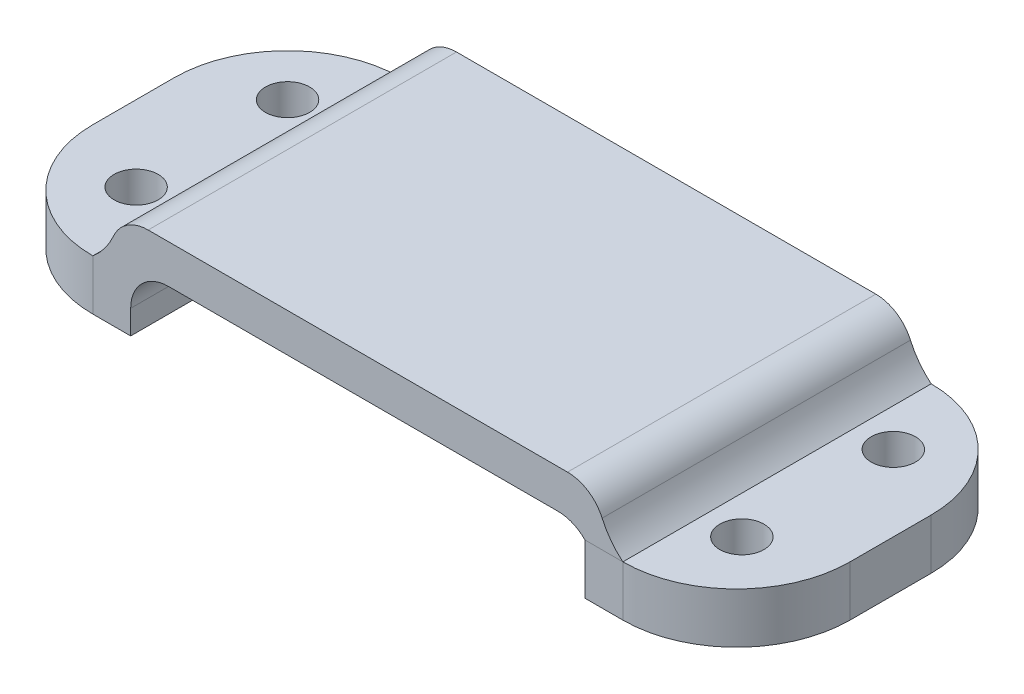
ISO-10303-21;
HEADER;
FILE_DESCRIPTION(('STEP AP214'),'2;1');
FILE_NAME('part.step','',(''),(''),'','','');
FILE_SCHEMA(('AUTOMOTIVE_DESIGN { 1 0 10303 214 1 1 1 1 }'));
ENDSEC;
DATA;
#1=APPLICATION_CONTEXT('core data for automotive mechanical design processes');
#2=APPLICATION_PROTOCOL_DEFINITION('international standard','automotive_design',2000,#1);
#3=PRODUCT_CONTEXT('',#1,'mechanical');
#4=PRODUCT('Part','Part','',(#3));
#5=PRODUCT_RELATED_PRODUCT_CATEGORY('part','',(#4));
#6=PRODUCT_DEFINITION_FORMATION('','',#4);
#7=PRODUCT_DEFINITION_CONTEXT('part definition',#1,'design');
#8=PRODUCT_DEFINITION('design','',#6,#7);
#9=PRODUCT_DEFINITION_SHAPE('','',#8);
#10=(LENGTH_UNIT() NAMED_UNIT(*) SI_UNIT(.MILLI.,.METRE.));
#11=(NAMED_UNIT(*) PLANE_ANGLE_UNIT() SI_UNIT($,.RADIAN.));
#12=(NAMED_UNIT(*) SI_UNIT($,.STERADIAN.) SOLID_ANGLE_UNIT());
#13=UNCERTAINTY_MEASURE_WITH_UNIT(LENGTH_MEASURE(1.E-05),#10,'distance_accuracy_value','');
#14=(GEOMETRIC_REPRESENTATION_CONTEXT(3) GLOBAL_UNCERTAINTY_ASSIGNED_CONTEXT((#13)) GLOBAL_UNIT_ASSIGNED_CONTEXT((#10,
#11,#12)) REPRESENTATION_CONTEXT('',''));
#15=CARTESIAN_POINT('',(0.,0.,0.));
#16=DIRECTION('',(0.,0.,1.));
#17=DIRECTION('',(1.,0.,0.));
#18=AXIS2_PLACEMENT_3D('',#15,#16,#17);
#19=CARTESIAN_POINT('',(0.,4.,-12.215));
#20=DIRECTION('',(0.,0.,1.));
#21=DIRECTION('',(1.,0.,0.));
#22=AXIS2_PLACEMENT_3D('',#19,#20,#21);
#23=PLANE('',#22);
#24=DIRECTION('',(-1.,0.,0.));
#25=VECTOR('',#24,1.);
#26=CARTESIAN_POINT('',(0.,4.,-12.215));
#27=LINE('',#26,#25);
#28=CARTESIAN_POINT('',(21.,4.,-12.215));
#29=VERTEX_POINT('',#28);
#30=CARTESIAN_POINT('',(18.,4.,-12.215));
#31=VERTEX_POINT('',#30);
#32=EDGE_CURVE('E105',#29,#31,#27,.T.);
#33=ORIENTED_EDGE('',*,*,#32,.F.);
#34=DIRECTION('',(0.,-1.,0.));
#35=VECTOR('',#34,1.);
#36=CARTESIAN_POINT('',(21.,4.,-12.215));
#37=LINE('',#36,#35);
#38=CARTESIAN_POINT('',(21.,0.,-12.215));
#39=VERTEX_POINT('',#38);
#40=EDGE_CURVE('E129',#29,#39,#37,.T.);
#41=ORIENTED_EDGE('',*,*,#40,.T.);
#42=DIRECTION('',(-1.,0.,0.));
#43=VECTOR('',#42,1.);
#44=CARTESIAN_POINT('',(0.,0.,-12.215));
#45=LINE('',#44,#43);
#46=CARTESIAN_POINT('',(18.,0.,-12.215));
#47=VERTEX_POINT('',#46);
#48=EDGE_CURVE('E127',#39,#47,#45,.T.);
#49=ORIENTED_EDGE('',*,*,#48,.T.);
#50=DIRECTION('',(0.,-1.,0.));
#51=VECTOR('',#50,1.);
#52=CARTESIAN_POINT('',(18.,4.,-12.215));
#53=LINE('',#52,#51);
#54=EDGE_CURVE('E121',#31,#47,#53,.T.);
#55=ORIENTED_EDGE('',*,*,#54,.F.);
#56=EDGE_LOOP('',(#33,#41,#49,#55));
#57=FACE_BOUND('',#56,.T.);
#58=ADVANCED_FACE('F51',(#57),#23,.F.);
#59=CARTESIAN_POINT('',(18.,4.,0.));
#60=DIRECTION('',(1.,0.,0.));
#61=DIRECTION('',(0.,0.,-1.));
#62=AXIS2_PLACEMENT_3D('',#59,#60,#61);
#63=PLANE('',#62);
#64=DIRECTION('',(0.,0.,1.));
#65=VECTOR('',#64,1.);
#66=CARTESIAN_POINT('',(18.,0.,0.));
#67=LINE('',#66,#65);
#68=CARTESIAN_POINT('',(18.,0.,12.215));
#69=VERTEX_POINT('',#68);
#70=EDGE_CURVE('E155',#47,#69,#67,.T.);
#71=ORIENTED_EDGE('',*,*,#70,.T.);
#72=DIRECTION('',(0.,-1.,0.));
#73=VECTOR('',#72,1.);
#74=CARTESIAN_POINT('',(18.,4.,12.215));
#75=LINE('',#74,#73);
#76=CARTESIAN_POINT('',(18.,4.,12.215));
#77=VERTEX_POINT('',#76);
#78=EDGE_CURVE('E123',#77,#69,#75,.T.);
#79=ORIENTED_EDGE('',*,*,#78,.F.);
#80=DIRECTION('',(0.,0.,1.));
#81=VECTOR('',#80,1.);
#82=CARTESIAN_POINT('',(18.,4.,0.));
#83=LINE('',#82,#81);
#84=EDGE_CURVE('E108',#31,#77,#83,.T.);
#85=ORIENTED_EDGE('',*,*,#84,.F.);
#86=ORIENTED_EDGE('',*,*,#54,.T.);
#87=EDGE_LOOP('',(#71,#79,#85,#86));
#88=FACE_BOUND('',#87,.T.);
#89=ADVANCED_FACE('F120',(#88),#63,.F.);
#90=CARTESIAN_POINT('',(0.,4.,12.215));
#91=DIRECTION('',(0.,0.,1.));
#92=DIRECTION('',(1.,0.,0.));
#93=AXIS2_PLACEMENT_3D('',#90,#91,#92);
#94=PLANE('',#93);
#95=DIRECTION('',(-1.,0.,0.));
#96=VECTOR('',#95,1.);
#97=CARTESIAN_POINT('',(0.,0.,12.215));
#98=LINE('',#97,#96);
#99=CARTESIAN_POINT('',(21.,0.,12.215));
#100=VERTEX_POINT('',#99);
#101=EDGE_CURVE('E153',#100,#69,#98,.T.);
#102=ORIENTED_EDGE('',*,*,#101,.F.);
#103=DIRECTION('',(0.,-1.,0.));
#104=VECTOR('',#103,1.);
#105=CARTESIAN_POINT('',(21.,4.,12.215));
#106=LINE('',#105,#104);
#107=CARTESIAN_POINT('',(21.,4.,12.215));
#108=VERTEX_POINT('',#107);
#109=EDGE_CURVE('E12',#100,#108,#106,.F.);
#110=ORIENTED_EDGE('',*,*,#109,.T.);
#111=DIRECTION('',(-1.,0.,0.));
#112=VECTOR('',#111,1.);
#113=CARTESIAN_POINT('',(0.,4.,12.215));
#114=LINE('',#113,#112);
#115=EDGE_CURVE('E124',#108,#77,#114,.T.);
#116=ORIENTED_EDGE('',*,*,#115,.T.);
#117=ORIENTED_EDGE('',*,*,#78,.T.);
#118=EDGE_LOOP('',(#102,#110,#116,#117));
#119=FACE_BOUND('',#118,.T.);
#120=ADVANCED_FACE('F154',(#119),#94,.T.);
#121=CARTESIAN_POINT('',(30.,4.,0.));
#122=DIRECTION('',(-1.,0.,0.));
#123=DIRECTION('',(0.,0.,1.));
#124=AXIS2_PLACEMENT_3D('',#121,#122,#123);
#125=PLANE('',#124);
#126=DIRECTION('',(0.,0.,-1.));
#127=VECTOR('',#126,1.);
#128=CARTESIAN_POINT('',(30.,0.,0.));
#129=LINE('',#128,#127);
#130=CARTESIAN_POINT('',(30.,0.,3.215));
#131=VERTEX_POINT('',#130);
#132=CARTESIAN_POINT('',(30.,0.,-3.215));
#133=VERTEX_POINT('',#132);
#134=EDGE_CURVE('E115',#131,#133,#129,.T.);
#135=ORIENTED_EDGE('',*,*,#134,.T.);
#136=DIRECTION('',(0.,-1.,0.));
#137=VECTOR('',#136,1.);
#138=CARTESIAN_POINT('',(30.,4.,-3.215));
#139=LINE('',#138,#137);
#140=CARTESIAN_POINT('',(30.,4.,-3.215));
#141=VERTEX_POINT('',#140);
#142=EDGE_CURVE('E72',#133,#141,#139,.F.);
#143=ORIENTED_EDGE('',*,*,#142,.T.);
#144=DIRECTION('',(0.,0.,-1.));
#145=VECTOR('',#144,1.);
#146=CARTESIAN_POINT('',(30.,4.,0.));
#147=LINE('',#146,#145);
#148=CARTESIAN_POINT('',(30.,4.,3.215));
#149=VERTEX_POINT('',#148);
#150=EDGE_CURVE('E133',#149,#141,#147,.T.);
#151=ORIENTED_EDGE('',*,*,#150,.F.);
#152=DIRECTION('',(0.,-1.,0.));
#153=VECTOR('',#152,1.);
#154=CARTESIAN_POINT('',(30.,0.,3.215));
#155=LINE('',#154,#153);
#156=EDGE_CURVE('E140',#149,#131,#155,.T.);
#157=ORIENTED_EDGE('',*,*,#156,.T.);
#158=EDGE_LOOP('',(#135,#143,#151,#157));
#159=FACE_BOUND('',#158,.T.);
#160=ADVANCED_FACE('F148',(#159),#125,.F.);
#161=CARTESIAN_POINT('',(0.,4.,0.));
#162=DIRECTION('',(0.,1.,0.));
#163=DIRECTION('',(0.,0.,1.));
#164=AXIS2_PLACEMENT_3D('',#161,#162,#163);
#165=PLANE('',#164);
#166=CARTESIAN_POINT('',(24.,4.,-6.21499999999999));
#167=DIRECTION('',(0.,1.,0.));
#168=DIRECTION('',(0.,0.,1.));
#169=AXIS2_PLACEMENT_3D('',#166,#167,#168);
#170=CIRCLE('',#169,1.75);
#171=CARTESIAN_POINT('',(24.,4.,-4.46499999999999));
#172=VERTEX_POINT('',#171);
#173=EDGE_CURVE('E168',#172,#172,#170,.T.);
#174=ORIENTED_EDGE('',*,*,#173,.F.);
#175=EDGE_LOOP('',(#174));
#176=FACE_BOUND('',#175,.T.);
#177=CARTESIAN_POINT('',(24.0000000000001,4.,5.78500000000001));
#178=DIRECTION('',(0.,1.,0.));
#179=DIRECTION('',(0.,0.,1.));
#180=AXIS2_PLACEMENT_3D('',#177,#178,#179);
#181=CIRCLE('',#180,1.75);
#182=CARTESIAN_POINT('',(24.0000000000001,4.,7.53500000000001));
#183=VERTEX_POINT('',#182);
#184=EDGE_CURVE('E162',#183,#183,#181,.T.);
#185=ORIENTED_EDGE('',*,*,#184,.F.);
#186=EDGE_LOOP('',(#185));
#187=FACE_BOUND('',#186,.T.);
#188=ORIENTED_EDGE('',*,*,#150,.T.);
#189=CARTESIAN_POINT('',(21.,4.,-3.215));
#190=DIRECTION('',(0.,1.,0.));
#191=DIRECTION('',(0.,0.,1.));
#192=AXIS2_PLACEMENT_3D('',#189,#190,#191);
#193=CIRCLE('',#192,9.);
#194=EDGE_CURVE('E59',#141,#29,#193,.T.);
#195=ORIENTED_EDGE('',*,*,#194,.T.);
#196=ORIENTED_EDGE('',*,*,#32,.T.);
#197=ORIENTED_EDGE('',*,*,#84,.T.);
#198=ORIENTED_EDGE('',*,*,#115,.F.);
#199=CARTESIAN_POINT('',(21.,4.,3.215));
#200=DIRECTION('',(0.,1.,0.));
#201=DIRECTION('',(0.,0.,1.));
#202=AXIS2_PLACEMENT_3D('',#199,#200,#201);
#203=CIRCLE('',#202,9.);
#204=EDGE_CURVE('E144',#108,#149,#203,.T.);
#205=ORIENTED_EDGE('',*,*,#204,.T.);
#206=EDGE_LOOP('',(#188,#195,#196,#197,#198,#205));
#207=FACE_BOUND('',#206,.T.);
#208=ADVANCED_FACE('F107',(#176,#187,#207),#165,.T.);
#209=CARTESIAN_POINT('',(0.,0.,0.));
#210=DIRECTION('',(0.,1.,0.));
#211=DIRECTION('',(0.,0.,1.));
#212=AXIS2_PLACEMENT_3D('',#209,#210,#211);
#213=PLANE('',#212);
#214=CARTESIAN_POINT('',(24.,0.,-6.21499999999999));
#215=DIRECTION('',(0.,1.,0.));
#216=DIRECTION('',(0.,0.,1.));
#217=AXIS2_PLACEMENT_3D('',#214,#215,#216);
#218=CIRCLE('',#217,1.75);
#219=CARTESIAN_POINT('',(24.,0.,-4.46499999999999));
#220=VERTEX_POINT('',#219);
#221=EDGE_CURVE('E159',#220,#220,#218,.T.);
#222=ORIENTED_EDGE('',*,*,#221,.T.);
#223=EDGE_LOOP('',(#222));
#224=FACE_BOUND('',#223,.T.);
#225=CARTESIAN_POINT('',(24.0000000000001,0.,5.78500000000001));
#226=DIRECTION('',(0.,1.,0.));
#227=DIRECTION('',(0.,0.,1.));
#228=AXIS2_PLACEMENT_3D('',#225,#226,#227);
#229=CIRCLE('',#228,1.75);
#230=CARTESIAN_POINT('',(24.0000000000001,0.,7.53500000000001));
#231=VERTEX_POINT('',#230);
#232=EDGE_CURVE('E165',#231,#231,#229,.T.);
#233=ORIENTED_EDGE('',*,*,#232,.T.);
#234=EDGE_LOOP('',(#233));
#235=FACE_BOUND('',#234,.T.);
#236=ORIENTED_EDGE('',*,*,#48,.F.);
#237=CARTESIAN_POINT('',(21.,0.,-3.215));
#238=DIRECTION('',(0.,1.,0.));
#239=DIRECTION('',(0.,0.,1.));
#240=AXIS2_PLACEMENT_3D('',#237,#238,#239);
#241=CIRCLE('',#240,9.);
#242=EDGE_CURVE('E138',#39,#133,#241,.F.);
#243=ORIENTED_EDGE('',*,*,#242,.T.);
#244=ORIENTED_EDGE('',*,*,#134,.F.);
#245=CARTESIAN_POINT('',(21.,0.,3.215));
#246=DIRECTION('',(0.,1.,0.));
#247=DIRECTION('',(0.,0.,1.));
#248=AXIS2_PLACEMENT_3D('',#245,#246,#247);
#249=CIRCLE('',#248,9.);
#250=EDGE_CURVE('E131',#131,#100,#249,.F.);
#251=ORIENTED_EDGE('',*,*,#250,.T.);
#252=ORIENTED_EDGE('',*,*,#101,.T.);
#253=ORIENTED_EDGE('',*,*,#70,.F.);
#254=EDGE_LOOP('',(#236,#243,#244,#251,#252,#253));
#255=FACE_BOUND('',#254,.T.);
#256=ADVANCED_FACE('F152',(#224,#235,#255),#213,.F.);
#257=CARTESIAN_POINT('',(24.0000000000001,0.,5.78500000000001));
#258=DIRECTION('',(0.,1.,0.));
#259=DIRECTION('',(0.,0.,1.));
#260=AXIS2_PLACEMENT_3D('',#257,#258,#259);
#261=CYLINDRICAL_SURFACE('',#260,1.75);
#262=ORIENTED_EDGE('',*,*,#232,.F.);
#263=EDGE_LOOP('',(#262));
#264=FACE_BOUND('',#263,.T.);
#265=ORIENTED_EDGE('',*,*,#184,.T.);
#266=EDGE_LOOP('',(#265));
#267=FACE_BOUND('',#266,.T.);
#268=ADVANCED_FACE('F180',(#264,#267),#261,.F.);
#269=CARTESIAN_POINT('',(24.,0.,-6.21499999999999));
#270=DIRECTION('',(0.,1.,0.));
#271=DIRECTION('',(0.,0.,1.));
#272=AXIS2_PLACEMENT_3D('',#269,#270,#271);
#273=CYLINDRICAL_SURFACE('',#272,1.75);
#274=ORIENTED_EDGE('',*,*,#221,.F.);
#275=EDGE_LOOP('',(#274));
#276=FACE_BOUND('',#275,.T.);
#277=ORIENTED_EDGE('',*,*,#173,.T.);
#278=EDGE_LOOP('',(#277));
#279=FACE_BOUND('',#278,.T.);
#280=ADVANCED_FACE('F176',(#276,#279),#273,.F.);
#281=CARTESIAN_POINT('',(21.,4.,-3.215));
#282=DIRECTION('',(0.,-1.,0.));
#283=DIRECTION('',(0.,0.,-1.));
#284=AXIS2_PLACEMENT_3D('',#281,#282,#283);
#285=CYLINDRICAL_SURFACE('',#284,9.);
#286=ORIENTED_EDGE('',*,*,#194,.F.);
#287=ORIENTED_EDGE('',*,*,#142,.F.);
#288=ORIENTED_EDGE('',*,*,#242,.F.);
#289=ORIENTED_EDGE('',*,*,#40,.F.);
#290=EDGE_LOOP('',(#286,#287,#288,#289));
#291=FACE_BOUND('',#290,.T.);
#292=ADVANCED_FACE('F179',(#291),#285,.T.);
#293=CARTESIAN_POINT('',(21.,4.,3.215));
#294=DIRECTION('',(0.,1.,0.));
#295=DIRECTION('',(0.,0.,1.));
#296=AXIS2_PLACEMENT_3D('',#293,#294,#295);
#297=CYLINDRICAL_SURFACE('',#296,9.);
#298=ORIENTED_EDGE('',*,*,#204,.F.);
#299=ORIENTED_EDGE('',*,*,#109,.F.);
#300=ORIENTED_EDGE('',*,*,#250,.F.);
#301=ORIENTED_EDGE('',*,*,#156,.F.);
#302=EDGE_LOOP('',(#298,#299,#300,#301));
#303=FACE_BOUND('',#302,.T.);
#304=ADVANCED_FACE('F53',(#303),#297,.T.);
#305=CLOSED_SHELL('',(#58,#89,#120,#160,#208,#256,#268,#280,#292,#304));
#306=MANIFOLD_SOLID_BREP('B2',#305);
#307=CARTESIAN_POINT('',(0.,4.,0.));
#308=DIRECTION('',(0.,1.,0.));
#309=DIRECTION('',(0.,0.,1.));
#310=AXIS2_PLACEMENT_3D('',#307,#308,#309);
#311=PLANE('',#310);
#312=CARTESIAN_POINT('',(-24.,4.,-6.21499999999999));
#313=DIRECTION('',(0.,1.,0.));
#314=DIRECTION('',(0.,0.,1.));
#315=AXIS2_PLACEMENT_3D('',#312,#313,#314);
#316=CIRCLE('',#315,1.75);
#317=CARTESIAN_POINT('',(-24.,4.,-4.46499999999999));
#318=VERTEX_POINT('',#317);
#319=EDGE_CURVE('E436',#318,#318,#316,.T.);
#320=ORIENTED_EDGE('',*,*,#319,.F.);
#321=EDGE_LOOP('',(#320));
#322=FACE_BOUND('',#321,.T.);
#323=CARTESIAN_POINT('',(-23.9999999999999,4.,5.78500000000001));
#324=DIRECTION('',(0.,1.,0.));
#325=DIRECTION('',(0.,0.,1.));
#326=AXIS2_PLACEMENT_3D('',#323,#324,#325);
#327=CIRCLE('',#326,1.75);
#328=CARTESIAN_POINT('',(-23.9999999999999,4.,7.53500000000001));
#329=VERTEX_POINT('',#328);
#330=EDGE_CURVE('E423',#329,#329,#327,.T.);
#331=ORIENTED_EDGE('',*,*,#330,.F.);
#332=EDGE_LOOP('',(#331));
#333=FACE_BOUND('',#332,.T.);
#334=CARTESIAN_POINT('',(-21.,4.,3.21499999999998));
#335=DIRECTION('',(0.,1.,0.));
#336=DIRECTION('',(0.,0.,1.));
#337=AXIS2_PLACEMENT_3D('',#334,#335,#336);
#338=CIRCLE('',#337,9.);
#339=CARTESIAN_POINT('',(-30.,4.,3.21499999999998));
#340=VERTEX_POINT('',#339);
#341=CARTESIAN_POINT('',(-21.,4.,12.215));
#342=VERTEX_POINT('',#341);
#343=EDGE_CURVE('E492',#340,#342,#338,.T.);
#344=ORIENTED_EDGE('',*,*,#343,.T.);
#345=DIRECTION('',(0.,0.,-1.));
#346=VECTOR('',#345,1.);
#347=CARTESIAN_POINT('',(-21.,4.,33.5861188565665));
#348=LINE('',#347,#346);
#349=CARTESIAN_POINT('',(-21.,4.,-12.215));
#350=VERTEX_POINT('',#349);
#351=EDGE_CURVE('E414',#342,#350,#348,.T.);
#352=ORIENTED_EDGE('',*,*,#351,.T.);
#353=CARTESIAN_POINT('',(-21.,4.,-3.21499999999999));
#354=DIRECTION('',(0.,1.,0.));
#355=DIRECTION('',(0.,0.,1.));
#356=AXIS2_PLACEMENT_3D('',#353,#354,#355);
#357=CIRCLE('',#356,9.);
#358=CARTESIAN_POINT('',(-30.,4.,-3.21499999999999));
#359=VERTEX_POINT('',#358);
#360=EDGE_CURVE('E489',#350,#359,#357,.T.);
#361=ORIENTED_EDGE('',*,*,#360,.T.);
#362=DIRECTION('',(0.,0.,-1.));
#363=VECTOR('',#362,1.);
#364=CARTESIAN_POINT('',(-30.,4.,0.));
#365=LINE('',#364,#363);
#366=EDGE_CURVE('E447',#340,#359,#365,.T.);
#367=ORIENTED_EDGE('',*,*,#366,.F.);
#368=EDGE_LOOP('',(#344,#352,#361,#367));
#369=FACE_BOUND('',#368,.T.);
#370=ADVANCED_FACE('F278',(#322,#333,#369),#311,.T.);
#371=CARTESIAN_POINT('',(-18.,4.,0.));
#372=DIRECTION('',(1.,0.,0.));
#373=DIRECTION('',(0.,0.,-1.));
#374=AXIS2_PLACEMENT_3D('',#371,#372,#373);
#375=PLANE('',#374);
#376=DIRECTION('',(0.,-1.,0.));
#377=VECTOR('',#376,1.);
#378=CARTESIAN_POINT('',(-18.,4.,-12.215));
#379=LINE('',#378,#377);
#380=CARTESIAN_POINT('',(-18.,1.9,-12.215));
#381=VERTEX_POINT('',#380);
#382=CARTESIAN_POINT('',(-18.,0.,-12.215));
#383=VERTEX_POINT('',#382);
#384=EDGE_CURVE('E469',#381,#383,#379,.T.);
#385=ORIENTED_EDGE('',*,*,#384,.F.);
#386=DIRECTION('',(0.,0.,-1.));
#387=VECTOR('',#386,1.);
#388=CARTESIAN_POINT('',(-18.,1.9,0.));
#389=LINE('',#388,#387);
#390=CARTESIAN_POINT('',(-18.,1.9,12.215));
#391=VERTEX_POINT('',#390);
#392=EDGE_CURVE('E524',#381,#391,#389,.F.);
#393=ORIENTED_EDGE('',*,*,#392,.T.);
#394=DIRECTION('',(0.,-1.,0.));
#395=VECTOR('',#394,1.);
#396=CARTESIAN_POINT('',(-18.,4.,12.215));
#397=LINE('',#396,#395);
#398=CARTESIAN_POINT('',(-18.,0.,12.215));
#399=VERTEX_POINT('',#398);
#400=EDGE_CURVE('E451',#391,#399,#397,.T.);
#401=ORIENTED_EDGE('',*,*,#400,.T.);
#402=DIRECTION('',(0.,0.,1.));
#403=VECTOR('',#402,1.);
#404=CARTESIAN_POINT('',(-18.,0.,0.));
#405=LINE('',#404,#403);
#406=EDGE_CURVE('E435',#383,#399,#405,.T.);
#407=ORIENTED_EDGE('',*,*,#406,.F.);
#408=EDGE_LOOP('',(#385,#393,#401,#407));
#409=FACE_BOUND('',#408,.T.);
#410=ADVANCED_FACE('F565',(#409),#375,.T.);
#411=CARTESIAN_POINT('',(0.,4.,-12.215));
#412=DIRECTION('',(0.,0.,1.));
#413=DIRECTION('',(1.,0.,0.));
#414=AXIS2_PLACEMENT_3D('',#411,#412,#413);
#415=PLANE('',#414);
#416=DIRECTION('',(-1.,0.,0.));
#417=VECTOR('',#416,1.);
#418=CARTESIAN_POINT('',(0.,7.96544085588126,-12.215));
#419=LINE('',#418,#417);
#420=CARTESIAN_POINT('',(16.6146747801771,7.96544085588126,-12.215));
#421=VERTEX_POINT('',#420);
#422=CARTESIAN_POINT('',(-16.6146747801771,7.96544085588126,-12.215));
#423=VERTEX_POINT('',#422);
#424=EDGE_CURVE('E415',#421,#423,#419,.T.);
#425=ORIENTED_EDGE('',*,*,#424,.F.);
#426=CARTESIAN_POINT('',(16.6146747801771,4.96544085588126,-12.215));
#427=DIRECTION('',(0.,0.,1.));
#428=DIRECTION('',(1.,0.,0.));
#429=AXIS2_PLACEMENT_3D('',#426,#427,#428);
#430=CIRCLE('',#429,3.);
#431=CARTESIAN_POINT('',(19.3583570407502,6.17878650037698,-12.215));
#432=VERTEX_POINT('',#431);
#433=EDGE_CURVE('E383',#421,#432,#430,.F.);
#434=ORIENTED_EDGE('',*,*,#433,.T.);
#435=CARTESIAN_POINT('',(24.8457215618963,8.60547778936843,-12.215));
#436=DIRECTION('',(0.,0.,1.));
#437=DIRECTION('',(1.,0.,0.));
#438=AXIS2_PLACEMENT_3D('',#435,#436,#437);
#439=CIRCLE('',#438,6.);
#440=CARTESIAN_POINT('',(21.,4.,-12.215));
#441=VERTEX_POINT('',#440);
#442=EDGE_CURVE('E378',#432,#441,#439,.T.);
#443=ORIENTED_EDGE('',*,*,#442,.T.);
#444=DIRECTION('',(-1.,0.,0.));
#445=VECTOR('',#444,1.);
#446=CARTESIAN_POINT('',(0.,4.,-12.215));
#447=LINE('',#446,#445);
#448=CARTESIAN_POINT('',(18.,4.,-12.215));
#449=VERTEX_POINT('',#448);
#450=EDGE_CURVE('E382',#441,#449,#447,.T.);
#451=ORIENTED_EDGE('',*,*,#450,.T.);
#452=CARTESIAN_POINT('',(15.8575714714371,1.9,-12.215));
#453=DIRECTION('',(0.,0.,1.));
#454=DIRECTION('',(1.,0.,0.));
#455=AXIS2_PLACEMENT_3D('',#452,#453,#454);
#456=CIRCLE('',#455,3.);
#457=CARTESIAN_POINT('',(15.8575714714371,4.9,-12.215));
#458=VERTEX_POINT('',#457);
#459=EDGE_CURVE('E527',#449,#458,#456,.T.);
#460=ORIENTED_EDGE('',*,*,#459,.T.);
#461=DIRECTION('',(-1.,0.,0.));
#462=VECTOR('',#461,1.);
#463=CARTESIAN_POINT('',(0.,4.9,-12.215));
#464=LINE('',#463,#462);
#465=CARTESIAN_POINT('',(-15.,4.9,-12.215));
#466=VERTEX_POINT('',#465);
#467=EDGE_CURVE('E410',#458,#466,#464,.T.);
#468=ORIENTED_EDGE('',*,*,#467,.T.);
#469=CARTESIAN_POINT('',(-15.,1.9,-12.215));
#470=DIRECTION('',(0.,0.,1.));
#471=DIRECTION('',(1.,0.,0.));
#472=AXIS2_PLACEMENT_3D('',#469,#470,#471);
#473=CIRCLE('',#472,3.);
#474=EDGE_CURVE('E533',#466,#381,#473,.T.);
#475=ORIENTED_EDGE('',*,*,#474,.T.);
#476=ORIENTED_EDGE('',*,*,#384,.T.);
#477=DIRECTION('',(-1.,0.,0.));
#478=VECTOR('',#477,1.);
#479=CARTESIAN_POINT('',(0.,0.,-12.215));
#480=LINE('',#479,#478);
#481=CARTESIAN_POINT('',(-21.,0.,-12.215));
#482=VERTEX_POINT('',#481);
#483=EDGE_CURVE('E456',#383,#482,#480,.T.);
#484=ORIENTED_EDGE('',*,*,#483,.T.);
#485=DIRECTION('',(0.,-1.,0.));
#486=VECTOR('',#485,1.);
#487=CARTESIAN_POINT('',(-21.,4.,-12.215));
#488=LINE('',#487,#486);
#489=EDGE_CURVE('E496',#482,#350,#488,.F.);
#490=ORIENTED_EDGE('',*,*,#489,.T.);
#491=CARTESIAN_POINT('',(-24.8457215618963,8.60547778936842,-12.215));
#492=DIRECTION('',(0.,0.,1.));
#493=DIRECTION('',(1.,0.,0.));
#494=AXIS2_PLACEMENT_3D('',#491,#492,#493);
#495=CIRCLE('',#494,6.);
#496=CARTESIAN_POINT('',(-19.3583570407502,6.17878650037698,-12.215));
#497=VERTEX_POINT('',#496);
#498=EDGE_CURVE('E287',#350,#497,#495,.T.);
#499=ORIENTED_EDGE('',*,*,#498,.T.);
#500=CARTESIAN_POINT('',(-16.6146747801771,4.96544085588126,-12.215));
#501=DIRECTION('',(0.,0.,1.));
#502=DIRECTION('',(1.,0.,0.));
#503=AXIS2_PLACEMENT_3D('',#500,#501,#502);
#504=CIRCLE('',#503,3.);
#505=EDGE_CURVE('E506',#497,#423,#504,.F.);
#506=ORIENTED_EDGE('',*,*,#505,.T.);
#507=EDGE_LOOP('',(#425,#434,#443,#451,#460,#468,#475,#476,#484,#490,#499,#506));
#508=FACE_BOUND('',#507,.T.);
#509=ADVANCED_FACE('F381',(#508),#415,.F.);
#510=CARTESIAN_POINT('',(-30.,4.,0.));
#511=DIRECTION('',(-1.,0.,0.));
#512=DIRECTION('',(0.,0.,1.));
#513=AXIS2_PLACEMENT_3D('',#510,#511,#512);
#514=PLANE('',#513);
#515=DIRECTION('',(0.,0.,-1.));
#516=VECTOR('',#515,1.);
#517=CARTESIAN_POINT('',(-30.,0.,0.));
#518=LINE('',#517,#516);
#519=CARTESIAN_POINT('',(-30.,0.,3.21499999999998));
#520=VERTEX_POINT('',#519);
#521=CARTESIAN_POINT('',(-30.,0.,-3.21499999999999));
#522=VERTEX_POINT('',#521);
#523=EDGE_CURVE('E460',#520,#522,#518,.T.);
#524=ORIENTED_EDGE('',*,*,#523,.F.);
#525=DIRECTION('',(0.,-1.,0.));
#526=VECTOR('',#525,1.);
#527=CARTESIAN_POINT('',(-30.,4.,3.21499999999998));
#528=LINE('',#527,#526);
#529=EDGE_CURVE('E486',#520,#340,#528,.F.);
#530=ORIENTED_EDGE('',*,*,#529,.T.);
#531=ORIENTED_EDGE('',*,*,#366,.T.);
#532=DIRECTION('',(0.,-1.,0.));
#533=VECTOR('',#532,1.);
#534=CARTESIAN_POINT('',(-30.,0.,-3.21499999999999));
#535=LINE('',#534,#533);
#536=EDGE_CURVE('E482',#359,#522,#535,.T.);
#537=ORIENTED_EDGE('',*,*,#536,.T.);
#538=EDGE_LOOP('',(#524,#530,#531,#537));
#539=FACE_BOUND('',#538,.T.);
#540=ADVANCED_FACE('F581',(#539),#514,.T.);
#541=CARTESIAN_POINT('',(0.,4.,12.215));
#542=DIRECTION('',(0.,0.,-1.));
#543=DIRECTION('',(-1.,0.,0.));
#544=AXIS2_PLACEMENT_3D('',#541,#542,#543);
#545=PLANE('',#544);
#546=DIRECTION('',(-1.,0.,0.));
#547=VECTOR('',#546,1.);
#548=CARTESIAN_POINT('',(0.,4.,12.215));
#549=LINE('',#548,#547);
#550=CARTESIAN_POINT('',(21.,4.,12.215));
#551=VERTEX_POINT('',#550);
#552=CARTESIAN_POINT('',(18.,4.,12.215));
#553=VERTEX_POINT('',#552);
#554=EDGE_CURVE('E406',#551,#553,#549,.T.);
#555=ORIENTED_EDGE('',*,*,#554,.F.);
#556=CARTESIAN_POINT('',(24.8457215618963,8.60547778936843,12.215));
#557=DIRECTION('',(0.,0.,-1.));
#558=DIRECTION('',(-1.,0.,0.));
#559=AXIS2_PLACEMENT_3D('',#556,#557,#558);
#560=CIRCLE('',#559,6.);
#561=CARTESIAN_POINT('',(19.3583570407502,6.17878650037698,12.215));
#562=VERTEX_POINT('',#561);
#563=EDGE_CURVE('E389',#551,#562,#560,.T.);
#564=ORIENTED_EDGE('',*,*,#563,.T.);
#565=CARTESIAN_POINT('',(16.6146747801771,4.96544085588126,12.215));
#566=DIRECTION('',(0.,0.,-1.));
#567=DIRECTION('',(-1.,0.,0.));
#568=AXIS2_PLACEMENT_3D('',#565,#566,#567);
#569=CIRCLE('',#568,3.);
#570=CARTESIAN_POINT('',(16.6146747801771,7.96544085588126,12.215));
#571=VERTEX_POINT('',#570);
#572=EDGE_CURVE('E514',#562,#571,#569,.F.);
#573=ORIENTED_EDGE('',*,*,#572,.T.);
#574=DIRECTION('',(-1.,0.,0.));
#575=VECTOR('',#574,1.);
#576=CARTESIAN_POINT('',(0.,7.96544085588126,12.215));
#577=LINE('',#576,#575);
#578=CARTESIAN_POINT('',(-16.6146747801771,7.96544085588126,12.215));
#579=VERTEX_POINT('',#578);
#580=EDGE_CURVE('E419',#571,#579,#577,.T.);
#581=ORIENTED_EDGE('',*,*,#580,.T.);
#582=CARTESIAN_POINT('',(-16.6146747801771,4.96544085588126,12.215));
#583=DIRECTION('',(0.,0.,-1.));
#584=DIRECTION('',(-1.,0.,0.));
#585=AXIS2_PLACEMENT_3D('',#582,#583,#584);
#586=CIRCLE('',#585,3.);
#587=CARTESIAN_POINT('',(-19.3583570407502,6.17878650037698,12.215));
#588=VERTEX_POINT('',#587);
#589=EDGE_CURVE('E511',#579,#588,#586,.F.);
#590=ORIENTED_EDGE('',*,*,#589,.T.);
#591=CARTESIAN_POINT('',(-24.8457215618963,8.60547778936842,12.215));
#592=DIRECTION('',(0.,0.,-1.));
#593=DIRECTION('',(-1.,0.,0.));
#594=AXIS2_PLACEMENT_3D('',#591,#592,#593);
#595=CIRCLE('',#594,6.);
#596=EDGE_CURVE('E49',#588,#342,#595,.T.);
#597=ORIENTED_EDGE('',*,*,#596,.T.);
#598=DIRECTION('',(0.,-1.,0.));
#599=VECTOR('',#598,1.);
#600=CARTESIAN_POINT('',(-21.,0.,12.215));
#601=LINE('',#600,#599);
#602=CARTESIAN_POINT('',(-21.,0.,12.215));
#603=VERTEX_POINT('',#602);
#604=EDGE_CURVE('E472',#342,#603,#601,.T.);
#605=ORIENTED_EDGE('',*,*,#604,.T.);
#606=DIRECTION('',(1.,0.,0.));
#607=VECTOR('',#606,1.);
#608=CARTESIAN_POINT('',(0.,0.,12.215));
#609=LINE('',#608,#607);
#610=EDGE_CURVE('E452',#603,#399,#609,.T.);
#611=ORIENTED_EDGE('',*,*,#610,.T.);
#612=ORIENTED_EDGE('',*,*,#400,.F.);
#613=CARTESIAN_POINT('',(-15.,1.9,12.215));
#614=DIRECTION('',(0.,0.,-1.));
#615=DIRECTION('',(-1.,0.,0.));
#616=AXIS2_PLACEMENT_3D('',#613,#614,#615);
#617=CIRCLE('',#616,3.);
#618=CARTESIAN_POINT('',(-15.,4.9,12.215));
#619=VERTEX_POINT('',#618);
#620=EDGE_CURVE('E536',#391,#619,#617,.T.);
#621=ORIENTED_EDGE('',*,*,#620,.T.);
#622=DIRECTION('',(-1.,0.,0.));
#623=VECTOR('',#622,1.);
#624=CARTESIAN_POINT('',(0.,4.9,12.215));
#625=LINE('',#624,#623);
#626=CARTESIAN_POINT('',(15.8575714714371,4.9,12.215));
#627=VERTEX_POINT('',#626);
#628=EDGE_CURVE('E424',#627,#619,#625,.T.);
#629=ORIENTED_EDGE('',*,*,#628,.F.);
#630=CARTESIAN_POINT('',(15.8575714714371,1.9,12.215));
#631=DIRECTION('',(0.,0.,-1.));
#632=DIRECTION('',(-1.,0.,0.));
#633=AXIS2_PLACEMENT_3D('',#630,#631,#632);
#634=CIRCLE('',#633,3.);
#635=EDGE_CURVE('E530',#627,#553,#634,.T.);
#636=ORIENTED_EDGE('',*,*,#635,.T.);
#637=EDGE_LOOP('',(#555,#564,#573,#581,#590,#597,#605,#611,#612,#621,#629,#636));
#638=FACE_BOUND('',#637,.T.);
#639=ADVANCED_FACE('F588',(#638),#545,.F.);
#640=CARTESIAN_POINT('',(0.,0.,0.));
#641=DIRECTION('',(0.,1.,0.));
#642=DIRECTION('',(0.,0.,1.));
#643=AXIS2_PLACEMENT_3D('',#640,#641,#642);
#644=PLANE('',#643);
#645=CARTESIAN_POINT('',(-24.,0.,-6.21499999999999));
#646=DIRECTION('',(0.,1.,0.));
#647=DIRECTION('',(0.,0.,1.));
#648=AXIS2_PLACEMENT_3D('',#645,#646,#647);
#649=CIRCLE('',#648,1.75);
#650=CARTESIAN_POINT('',(-24.,0.,-4.46499999999999));
#651=VERTEX_POINT('',#650);
#652=EDGE_CURVE('E431',#651,#651,#649,.T.);
#653=ORIENTED_EDGE('',*,*,#652,.T.);
#654=EDGE_LOOP('',(#653));
#655=FACE_BOUND('',#654,.T.);
#656=CARTESIAN_POINT('',(-23.9999999999999,0.,5.78500000000001));
#657=DIRECTION('',(0.,1.,0.));
#658=DIRECTION('',(0.,0.,1.));
#659=AXIS2_PLACEMENT_3D('',#656,#657,#658);
#660=CIRCLE('',#659,1.75);
#661=CARTESIAN_POINT('',(-23.9999999999999,0.,7.53500000000001));
#662=VERTEX_POINT('',#661);
#663=EDGE_CURVE('E440',#662,#662,#660,.T.);
#664=ORIENTED_EDGE('',*,*,#663,.T.);
#665=EDGE_LOOP('',(#664));
#666=FACE_BOUND('',#665,.T.);
#667=ORIENTED_EDGE('',*,*,#610,.F.);
#668=CARTESIAN_POINT('',(-21.,0.,3.21499999999998));
#669=DIRECTION('',(0.,1.,0.));
#670=DIRECTION('',(0.,0.,1.));
#671=AXIS2_PLACEMENT_3D('',#668,#669,#670);
#672=CIRCLE('',#671,9.);
#673=EDGE_CURVE('E479',#603,#520,#672,.F.);
#674=ORIENTED_EDGE('',*,*,#673,.T.);
#675=ORIENTED_EDGE('',*,*,#523,.T.);
#676=CARTESIAN_POINT('',(-21.,0.,-3.21499999999999));
#677=DIRECTION('',(0.,1.,0.));
#678=DIRECTION('',(0.,0.,1.));
#679=AXIS2_PLACEMENT_3D('',#676,#677,#678);
#680=CIRCLE('',#679,9.);
#681=EDGE_CURVE('E476',#522,#482,#680,.F.);
#682=ORIENTED_EDGE('',*,*,#681,.T.);
#683=ORIENTED_EDGE('',*,*,#483,.F.);
#684=ORIENTED_EDGE('',*,*,#406,.T.);
#685=EDGE_LOOP('',(#667,#674,#675,#682,#683,#684));
#686=FACE_BOUND('',#685,.T.);
#687=ADVANCED_FACE('F569',(#655,#666,#686),#644,.F.);
#688=CARTESIAN_POINT('',(-23.9999999999999,0.,5.78500000000001));
#689=DIRECTION('',(0.,1.,0.));
#690=DIRECTION('',(0.,0.,1.));
#691=AXIS2_PLACEMENT_3D('',#688,#689,#690);
#692=CYLINDRICAL_SURFACE('',#691,1.75);
#693=ORIENTED_EDGE('',*,*,#663,.F.);
#694=EDGE_LOOP('',(#693));
#695=FACE_BOUND('',#694,.T.);
#696=ORIENTED_EDGE('',*,*,#330,.T.);
#697=EDGE_LOOP('',(#696));
#698=FACE_BOUND('',#697,.T.);
#699=ADVANCED_FACE('F618',(#695,#698),#692,.F.);
#700=CARTESIAN_POINT('',(-24.,0.,-6.21499999999999));
#701=DIRECTION('',(0.,1.,0.));
#702=DIRECTION('',(0.,0.,1.));
#703=AXIS2_PLACEMENT_3D('',#700,#701,#702);
#704=CYLINDRICAL_SURFACE('',#703,1.75);
#705=ORIENTED_EDGE('',*,*,#652,.F.);
#706=EDGE_LOOP('',(#705));
#707=FACE_BOUND('',#706,.T.);
#708=ORIENTED_EDGE('',*,*,#319,.T.);
#709=EDGE_LOOP('',(#708));
#710=FACE_BOUND('',#709,.T.);
#711=ADVANCED_FACE('F630',(#707,#710),#704,.F.);
#712=CARTESIAN_POINT('',(-21.,4.,3.21499999999998));
#713=DIRECTION('',(0.,1.,0.));
#714=DIRECTION('',(0.,0.,1.));
#715=AXIS2_PLACEMENT_3D('',#712,#713,#714);
#716=CYLINDRICAL_SURFACE('',#715,9.);
#717=ORIENTED_EDGE('',*,*,#343,.F.);
#718=ORIENTED_EDGE('',*,*,#529,.F.);
#719=ORIENTED_EDGE('',*,*,#673,.F.);
#720=ORIENTED_EDGE('',*,*,#604,.F.);
#721=EDGE_LOOP('',(#717,#718,#719,#720));
#722=FACE_BOUND('',#721,.T.);
#723=ADVANCED_FACE('F584',(#722),#716,.T.);
#724=CARTESIAN_POINT('',(-21.,4.,-3.21499999999999));
#725=DIRECTION('',(0.,1.,0.));
#726=DIRECTION('',(0.,0.,1.));
#727=AXIS2_PLACEMENT_3D('',#724,#725,#726);
#728=CYLINDRICAL_SURFACE('',#727,9.);
#729=ORIENTED_EDGE('',*,*,#360,.F.);
#730=ORIENTED_EDGE('',*,*,#489,.F.);
#731=ORIENTED_EDGE('',*,*,#681,.F.);
#732=ORIENTED_EDGE('',*,*,#536,.F.);
#733=EDGE_LOOP('',(#729,#730,#731,#732));
#734=FACE_BOUND('',#733,.T.);
#735=ADVANCED_FACE('F573',(#734),#728,.T.);
#736=CARTESIAN_POINT('',(0.,4.9,33.5861188565665));
#737=DIRECTION('',(0.,1.,0.));
#738=DIRECTION('',(0.,0.,1.));
#739=AXIS2_PLACEMENT_3D('',#736,#737,#738);
#740=PLANE('',#739);
#741=ORIENTED_EDGE('',*,*,#467,.F.);
#742=DIRECTION('',(0.,0.,-1.));
#743=VECTOR('',#742,1.);
#744=CARTESIAN_POINT('',(15.8575714714371,4.9,33.5861188565665));
#745=LINE('',#744,#743);
#746=EDGE_CURVE('E521',#458,#627,#745,.F.);
#747=ORIENTED_EDGE('',*,*,#746,.T.);
#748=ORIENTED_EDGE('',*,*,#628,.T.);
#749=DIRECTION('',(0.,0.,-1.));
#750=VECTOR('',#749,1.);
#751=CARTESIAN_POINT('',(-15.,4.9,33.5861188565665));
#752=LINE('',#751,#750);
#753=EDGE_CURVE('E517',#619,#466,#752,.T.);
#754=ORIENTED_EDGE('',*,*,#753,.T.);
#755=EDGE_LOOP('',(#741,#747,#748,#754));
#756=FACE_BOUND('',#755,.T.);
#757=ADVANCED_FACE('F554',(#756),#740,.F.);
#758=CARTESIAN_POINT('',(0.,7.96544085588126,33.5861188565665));
#759=DIRECTION('',(0.,1.,0.));
#760=DIRECTION('',(0.,0.,1.));
#761=AXIS2_PLACEMENT_3D('',#758,#759,#760);
#762=PLANE('',#761);
#763=ORIENTED_EDGE('',*,*,#580,.F.);
#764=DIRECTION('',(0.,0.,-1.));
#765=VECTOR('',#764,1.);
#766=CARTESIAN_POINT('',(16.6146747801771,7.96544085588126,-12.215));
#767=LINE('',#766,#765);
#768=EDGE_CURVE('E502',#571,#421,#767,.T.);
#769=ORIENTED_EDGE('',*,*,#768,.T.);
#770=ORIENTED_EDGE('',*,*,#424,.T.);
#771=DIRECTION('',(0.,0.,-1.));
#772=VECTOR('',#771,1.);
#773=CARTESIAN_POINT('',(-16.6146747801771,7.96544085588126,33.5861188565665));
#774=LINE('',#773,#772);
#775=EDGE_CURVE('E499',#423,#579,#774,.F.);
#776=ORIENTED_EDGE('',*,*,#775,.T.);
#777=EDGE_LOOP('',(#763,#769,#770,#776));
#778=FACE_BOUND('',#777,.T.);
#779=ADVANCED_FACE('F593',(#778),#762,.T.);
#780=CARTESIAN_POINT('',(0.,4.,33.5861188565665));
#781=DIRECTION('',(0.,1.,0.));
#782=DIRECTION('',(0.,0.,1.));
#783=AXIS2_PLACEMENT_3D('',#780,#781,#782);
#784=PLANE('',#783);
#785=DIRECTION('',(0.,0.,-1.));
#786=VECTOR('',#785,1.);
#787=CARTESIAN_POINT('',(21.,4.,33.5861188565665));
#788=LINE('',#787,#786);
#789=EDGE_CURVE('E396',#551,#441,#788,.T.);
#790=ORIENTED_EDGE('',*,*,#789,.F.);
#791=ORIENTED_EDGE('',*,*,#554,.T.);
#792=DIRECTION('',(0.,0.,-1.));
#793=VECTOR('',#792,1.);
#794=CARTESIAN_POINT('',(18.,4.,33.5861188565665));
#795=LINE('',#794,#793);
#796=EDGE_CURVE('E399',#553,#449,#795,.T.);
#797=ORIENTED_EDGE('',*,*,#796,.T.);
#798=ORIENTED_EDGE('',*,*,#450,.F.);
#799=EDGE_LOOP('',(#790,#791,#797,#798));
#800=FACE_BOUND('',#799,.T.);
#801=ADVANCED_FACE('F394',(#800),#784,.F.);
#802=CARTESIAN_POINT('',(16.6146747801771,4.96544085588126,33.5861188565665));
#803=DIRECTION('',(0.,0.,1.));
#804=DIRECTION('',(1.,0.,0.));
#805=AXIS2_PLACEMENT_3D('',#802,#803,#804);
#806=CYLINDRICAL_SURFACE('',#805,3.);
#807=ORIENTED_EDGE('',*,*,#572,.F.);
#808=DIRECTION('',(0.,0.,1.));
#809=VECTOR('',#808,1.);
#810=CARTESIAN_POINT('',(19.3583570407502,6.17878650037698,33.5861188565665));
#811=LINE('',#810,#809);
#812=EDGE_CURVE('E539',#562,#432,#811,.F.);
#813=ORIENTED_EDGE('',*,*,#812,.T.);
#814=ORIENTED_EDGE('',*,*,#433,.F.);
#815=ORIENTED_EDGE('',*,*,#768,.F.);
#816=EDGE_LOOP('',(#807,#813,#814,#815));
#817=FACE_BOUND('',#816,.T.);
#818=ADVANCED_FACE('F597',(#817),#806,.T.);
#819=CARTESIAN_POINT('',(-16.6146747801771,4.96544085588126,33.5861188565665));
#820=DIRECTION('',(0.,0.,-1.));
#821=DIRECTION('',(-1.,0.,0.));
#822=AXIS2_PLACEMENT_3D('',#819,#820,#821);
#823=CYLINDRICAL_SURFACE('',#822,3.);
#824=ORIENTED_EDGE('',*,*,#505,.F.);
#825=DIRECTION('',(0.,0.,-1.));
#826=VECTOR('',#825,1.);
#827=CARTESIAN_POINT('',(-19.3583570407502,6.17878650037698,33.5861188565665));
#828=LINE('',#827,#826);
#829=EDGE_CURVE('E300',#497,#588,#828,.F.);
#830=ORIENTED_EDGE('',*,*,#829,.T.);
#831=ORIENTED_EDGE('',*,*,#589,.F.);
#832=ORIENTED_EDGE('',*,*,#775,.F.);
#833=EDGE_LOOP('',(#824,#830,#831,#832));
#834=FACE_BOUND('',#833,.T.);
#835=ADVANCED_FACE('F591',(#834),#823,.T.);
#836=CARTESIAN_POINT('',(15.8575714714371,1.9,33.5861188565665));
#837=DIRECTION('',(0.,0.,-1.));
#838=DIRECTION('',(-1.,0.,0.));
#839=AXIS2_PLACEMENT_3D('',#836,#837,#838);
#840=CYLINDRICAL_SURFACE('',#839,3.);
#841=ORIENTED_EDGE('',*,*,#635,.F.);
#842=ORIENTED_EDGE('',*,*,#746,.F.);
#843=ORIENTED_EDGE('',*,*,#459,.F.);
#844=ORIENTED_EDGE('',*,*,#796,.F.);
#845=EDGE_LOOP('',(#841,#842,#843,#844));
#846=FACE_BOUND('',#845,.T.);
#847=ADVANCED_FACE('F550',(#846),#840,.F.);
#848=CARTESIAN_POINT('',(-15.,1.9,33.5861188565665));
#849=DIRECTION('',(0.,0.,-1.));
#850=DIRECTION('',(-1.,0.,0.));
#851=AXIS2_PLACEMENT_3D('',#848,#849,#850);
#852=CYLINDRICAL_SURFACE('',#851,3.);
#853=ORIENTED_EDGE('',*,*,#620,.F.);
#854=ORIENTED_EDGE('',*,*,#392,.F.);
#855=ORIENTED_EDGE('',*,*,#474,.F.);
#856=ORIENTED_EDGE('',*,*,#753,.F.);
#857=EDGE_LOOP('',(#853,#854,#855,#856));
#858=FACE_BOUND('',#857,.T.);
#859=ADVANCED_FACE('F559',(#858),#852,.F.);
#860=CARTESIAN_POINT('',(24.8457215618963,8.60547778936843,33.5861188565665));
#861=DIRECTION('',(0.,0.,1.));
#862=DIRECTION('',(1.,0.,0.));
#863=AXIS2_PLACEMENT_3D('',#860,#861,#862);
#864=CYLINDRICAL_SURFACE('',#863,6.);
#865=ORIENTED_EDGE('',*,*,#563,.F.);
#866=ORIENTED_EDGE('',*,*,#789,.T.);
#867=ORIENTED_EDGE('',*,*,#442,.F.);
#868=ORIENTED_EDGE('',*,*,#812,.F.);
#869=EDGE_LOOP('',(#865,#866,#867,#868));
#870=FACE_BOUND('',#869,.T.);
#871=ADVANCED_FACE('F402',(#870),#864,.F.);
#872=CARTESIAN_POINT('',(-24.8457215618963,8.60547778936842,33.5861188565665));
#873=DIRECTION('',(0.,0.,1.));
#874=DIRECTION('',(1.,0.,0.));
#875=AXIS2_PLACEMENT_3D('',#872,#873,#874);
#876=CYLINDRICAL_SURFACE('',#875,6.);
#877=ORIENTED_EDGE('',*,*,#596,.F.);
#878=ORIENTED_EDGE('',*,*,#829,.F.);
#879=ORIENTED_EDGE('',*,*,#498,.F.);
#880=ORIENTED_EDGE('',*,*,#351,.F.);
#881=EDGE_LOOP('',(#877,#878,#879,#880));
#882=FACE_BOUND('',#881,.T.);
#883=ADVANCED_FACE('F280',(#882),#876,.F.);
#884=CLOSED_SHELL('',(#370,#410,#509,#540,#639,#687,#699,#711,#723,#735,#757,#779,#801,#818,
#835,#847,#859,#871,#883));
#885=MANIFOLD_SOLID_BREP('B6',#884);
#886=ADVANCED_BREP_SHAPE_REPRESENTATION('',(#18,#306,#885),#14);
#887=SHAPE_DEFINITION_REPRESENTATION(#9,#886);
ENDSEC;
END-ISO-10303-21;
